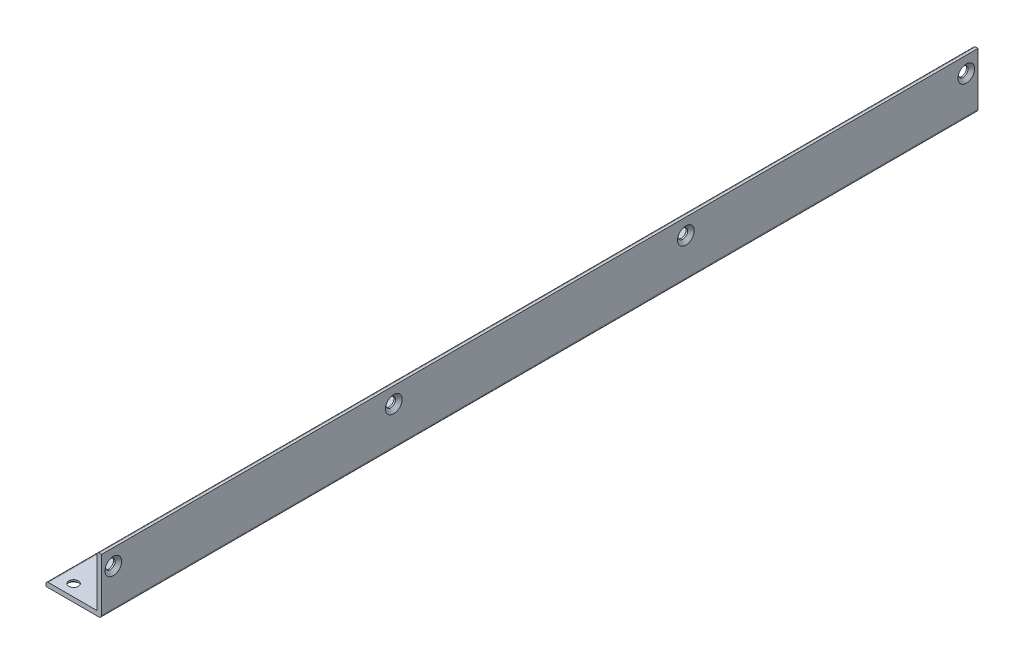
ISO-10303-21;
HEADER;
FILE_DESCRIPTION(('STEP AP214'),'2;1');
FILE_NAME('part.step','',(''),(''),'','','');
FILE_SCHEMA(('AUTOMOTIVE_DESIGN { 1 0 10303 214 1 1 1 1 }'));
ENDSEC;
DATA;
#1=APPLICATION_CONTEXT('core data for automotive mechanical design processes');
#2=APPLICATION_PROTOCOL_DEFINITION('international standard','automotive_design',2000,#1);
#3=PRODUCT_CONTEXT('',#1,'mechanical');
#4=PRODUCT('Part','Part','',(#3));
#5=PRODUCT_RELATED_PRODUCT_CATEGORY('part','',(#4));
#6=PRODUCT_DEFINITION_FORMATION('','',#4);
#7=PRODUCT_DEFINITION_CONTEXT('part definition',#1,'design');
#8=PRODUCT_DEFINITION('design','',#6,#7);
#9=PRODUCT_DEFINITION_SHAPE('','',#8);
#10=(LENGTH_UNIT() NAMED_UNIT(*) SI_UNIT(.MILLI.,.METRE.));
#11=(NAMED_UNIT(*) PLANE_ANGLE_UNIT() SI_UNIT($,.RADIAN.));
#12=(NAMED_UNIT(*) SI_UNIT($,.STERADIAN.) SOLID_ANGLE_UNIT());
#13=UNCERTAINTY_MEASURE_WITH_UNIT(LENGTH_MEASURE(1.E-05),#10,'distance_accuracy_value','');
#14=(GEOMETRIC_REPRESENTATION_CONTEXT(3) GLOBAL_UNCERTAINTY_ASSIGNED_CONTEXT((#13)) GLOBAL_UNIT_ASSIGNED_CONTEXT((#10,
#11,#12)) REPRESENTATION_CONTEXT('',''));
#15=CARTESIAN_POINT('',(0.,0.,0.));
#16=DIRECTION('',(0.,0.,1.));
#17=DIRECTION('',(1.,0.,0.));
#18=AXIS2_PLACEMENT_3D('',#15,#16,#17);
#19=CARTESIAN_POINT('',(8.73125,18.25625,-150.));
#20=DIRECTION('',(0.,0.,-1.));
#21=DIRECTION('',(-1.,0.,0.));
#22=AXIS2_PLACEMENT_3D('',#19,#20,#21);
#23=PLANE('',#22);
#24=DIRECTION('',(-1.,0.,0.));
#25=VECTOR('',#24,1.);
#26=CARTESIAN_POINT('',(7.14375000000001,1.5875,-150.));
#27=LINE('',#26,#25);
#28=CARTESIAN_POINT('',(7.93750000000001,1.5875,-150.));
#29=VERTEX_POINT('',#28);
#30=CARTESIAN_POINT('',(-8.73125,1.5875,-150.));
#31=VERTEX_POINT('',#30);
#32=EDGE_CURVE('E267',#29,#31,#27,.T.);
#33=ORIENTED_EDGE('',*,*,#32,.F.);
#34=DIRECTION('',(0.,-1.,0.));
#35=VECTOR('',#34,1.);
#36=CARTESIAN_POINT('',(7.9375,18.25625,-150.));
#37=LINE('',#36,#35);
#38=CARTESIAN_POINT('',(7.9375,18.25625,-150.));
#39=VERTEX_POINT('',#38);
#40=EDGE_CURVE('E146',#39,#29,#37,.T.);
#41=ORIENTED_EDGE('',*,*,#40,.F.);
#42=CARTESIAN_POINT('',(8.73125,18.25625,-150.));
#43=DIRECTION('',(0.,0.,1.));
#44=DIRECTION('',(-1.,0.,0.));
#45=AXIS2_PLACEMENT_3D('',#42,#43,#44);
#46=CIRCLE('',#45,0.793749999999999);
#47=CARTESIAN_POINT('',(8.73125,19.05,-150.));
#48=VERTEX_POINT('',#47);
#49=EDGE_CURVE('E264',#48,#39,#46,.T.);
#50=ORIENTED_EDGE('',*,*,#49,.F.);
#51=DIRECTION('',(-1.,0.,0.));
#52=VECTOR('',#51,1.);
#53=CARTESIAN_POINT('',(8.73125,19.05,-150.));
#54=LINE('',#53,#52);
#55=CARTESIAN_POINT('',(9.525,19.05,-150.));
#56=VERTEX_POINT('',#55);
#57=EDGE_CURVE('E262',#56,#48,#54,.T.);
#58=ORIENTED_EDGE('',*,*,#57,.F.);
#59=DIRECTION('',(0.,1.,0.));
#60=VECTOR('',#59,1.);
#61=CARTESIAN_POINT('',(9.525,0.,-150.));
#62=LINE('',#61,#60);
#63=CARTESIAN_POINT('',(9.525,1.,-150.));
#64=VERTEX_POINT('',#63);
#65=EDGE_CURVE('E260',#64,#56,#62,.T.);
#66=ORIENTED_EDGE('',*,*,#65,.F.);
#67=CARTESIAN_POINT('',(8.525,1.,-150.));
#68=DIRECTION('',(0.,0.,-1.));
#69=DIRECTION('',(-1.,0.,0.));
#70=AXIS2_PLACEMENT_3D('',#67,#68,#69);
#71=CIRCLE('',#70,1.);
#72=CARTESIAN_POINT('',(8.525,0.,-150.));
#73=VERTEX_POINT('',#72);
#74=EDGE_CURVE('E59',#64,#73,#71,.T.);
#75=ORIENTED_EDGE('',*,*,#74,.T.);
#76=DIRECTION('',(1.,0.,0.));
#77=VECTOR('',#76,1.);
#78=CARTESIAN_POINT('',(-9.525,0.,-150.));
#79=LINE('',#78,#77);
#80=CARTESIAN_POINT('',(-9.525,0.,-150.));
#81=VERTEX_POINT('',#80);
#82=EDGE_CURVE('E258',#81,#73,#79,.T.);
#83=ORIENTED_EDGE('',*,*,#82,.F.);
#84=DIRECTION('',(0.,-1.,0.));
#85=VECTOR('',#84,1.);
#86=CARTESIAN_POINT('',(-9.525,0.793749999999998,-150.));
#87=LINE('',#86,#85);
#88=CARTESIAN_POINT('',(-9.525,0.793749999999998,-150.));
#89=VERTEX_POINT('',#88);
#90=EDGE_CURVE('E255',#89,#81,#87,.T.);
#91=ORIENTED_EDGE('',*,*,#90,.F.);
#92=CARTESIAN_POINT('',(-8.73125,0.793749999999998,-150.));
#93=DIRECTION('',(0.,0.,1.));
#94=DIRECTION('',(-1.,0.,0.));
#95=AXIS2_PLACEMENT_3D('',#92,#93,#94);
#96=CIRCLE('',#95,0.793749999999998);
#97=EDGE_CURVE('E240',#31,#89,#96,.T.);
#98=ORIENTED_EDGE('',*,*,#97,.F.);
#99=EDGE_LOOP('',(#33,#41,#50,#58,#66,#75,#83,#91,#98));
#100=FACE_BOUND('',#99,.T.);
#101=ADVANCED_FACE('F35',(#100),#23,.T.);
#102=CARTESIAN_POINT('',(-9.525,0.793749999999998,150.));
#103=DIRECTION('',(1.,0.,0.));
#104=DIRECTION('',(0.,0.,-1.));
#105=AXIS2_PLACEMENT_3D('',#102,#103,#104);
#106=PLANE('',#105);
#107=ORIENTED_EDGE('',*,*,#90,.T.);
#108=DIRECTION('',(0.,0.,-1.));
#109=VECTOR('',#108,1.);
#110=CARTESIAN_POINT('',(-9.525,0.,150.));
#111=LINE('',#110,#109);
#112=CARTESIAN_POINT('',(-9.525,0.,150.));
#113=VERTEX_POINT('',#112);
#114=EDGE_CURVE('E286',#113,#81,#111,.T.);
#115=ORIENTED_EDGE('',*,*,#114,.F.);
#116=DIRECTION('',(0.,-1.,0.));
#117=VECTOR('',#116,1.);
#118=CARTESIAN_POINT('',(-9.525,0.793749999999998,150.));
#119=LINE('',#118,#117);
#120=CARTESIAN_POINT('',(-9.525,0.793749999999998,150.));
#121=VERTEX_POINT('',#120);
#122=EDGE_CURVE('E236',#121,#113,#119,.T.);
#123=ORIENTED_EDGE('',*,*,#122,.F.);
#124=DIRECTION('',(0.,0.,-1.));
#125=VECTOR('',#124,1.);
#126=CARTESIAN_POINT('',(-9.525,0.793749999999998,150.));
#127=LINE('',#126,#125);
#128=EDGE_CURVE('E254',#121,#89,#127,.T.);
#129=ORIENTED_EDGE('',*,*,#128,.T.);
#130=EDGE_LOOP('',(#107,#115,#123,#129));
#131=FACE_BOUND('',#130,.T.);
#132=ADVANCED_FACE('F326',(#131),#106,.F.);
#133=CARTESIAN_POINT('',(-9.525,0.,150.));
#134=DIRECTION('',(0.,1.,0.));
#135=DIRECTION('',(0.,0.,1.));
#136=AXIS2_PLACEMENT_3D('',#133,#134,#135);
#137=PLANE('',#136);
#138=CARTESIAN_POINT('',(-4.06249999999998,0.,50.));
#139=DIRECTION('',(0.,-1.,0.));
#140=DIRECTION('',(0.,0.,-1.));
#141=AXIS2_PLACEMENT_3D('',#138,#139,#140);
#142=CIRCLE('',#141,2.8575);
#143=CARTESIAN_POINT('',(-4.06249999999998,0.,47.1425));
#144=VERTEX_POINT('',#143);
#145=EDGE_CURVE('E163',#144,#144,#142,.T.);
#146=ORIENTED_EDGE('',*,*,#145,.F.);
#147=EDGE_LOOP('',(#146));
#148=FACE_BOUND('',#147,.T.);
#149=CARTESIAN_POINT('',(-4.06249999999998,0.,-50.));
#150=DIRECTION('',(0.,-1.,0.));
#151=DIRECTION('',(0.,0.,-1.));
#152=AXIS2_PLACEMENT_3D('',#149,#150,#151);
#153=CIRCLE('',#152,2.8575);
#154=CARTESIAN_POINT('',(-4.06249999999998,0.,-52.8575));
#155=VERTEX_POINT('',#154);
#156=EDGE_CURVE('E183',#155,#155,#153,.T.);
#157=ORIENTED_EDGE('',*,*,#156,.F.);
#158=EDGE_LOOP('',(#157));
#159=FACE_BOUND('',#158,.T.);
#160=CARTESIAN_POINT('',(3.49375000000001,0.,129.88));
#161=DIRECTION('',(0.,1.,0.));
#162=DIRECTION('',(0.,0.,1.));
#163=AXIS2_PLACEMENT_3D('',#160,#161,#162);
#164=CIRCLE('',#163,2.0574);
#165=CARTESIAN_POINT('',(3.49375000000001,0.,131.9374));
#166=VERTEX_POINT('',#165);
#167=EDGE_CURVE('E190',#166,#166,#164,.T.);
#168=ORIENTED_EDGE('',*,*,#167,.T.);
#169=EDGE_LOOP('',(#168));
#170=FACE_BOUND('',#169,.T.);
#171=CARTESIAN_POINT('',(-1.30624999999999,0.,129.88));
#172=DIRECTION('',(0.,1.,0.));
#173=DIRECTION('',(0.,0.,1.));
#174=AXIS2_PLACEMENT_3D('',#171,#172,#173);
#175=CIRCLE('',#174,2.0574);
#176=CARTESIAN_POINT('',(-1.30624999999999,0.,131.9374));
#177=VERTEX_POINT('',#176);
#178=EDGE_CURVE('E199',#177,#177,#175,.T.);
#179=ORIENTED_EDGE('',*,*,#178,.T.);
#180=EDGE_LOOP('',(#179));
#181=FACE_BOUND('',#180,.T.);
#182=CARTESIAN_POINT('',(-4.06250000000002,0.,146.));
#183=DIRECTION('',(0.,-1.,0.));
#184=DIRECTION('',(0.,0.,-1.));
#185=AXIS2_PLACEMENT_3D('',#182,#183,#184);
#186=CIRCLE('',#185,2.8575);
#187=CARTESIAN_POINT('',(-4.06250000000002,0.,143.1425));
#188=VERTEX_POINT('',#187);
#189=EDGE_CURVE('E222',#188,#188,#186,.T.);
#190=ORIENTED_EDGE('',*,*,#189,.F.);
#191=EDGE_LOOP('',(#190));
#192=FACE_BOUND('',#191,.T.);
#193=CARTESIAN_POINT('',(-4.06249999999998,0.,-146.));
#194=DIRECTION('',(0.,-1.,0.));
#195=DIRECTION('',(0.,0.,-1.));
#196=AXIS2_PLACEMENT_3D('',#193,#194,#195);
#197=CIRCLE('',#196,2.8575);
#198=CARTESIAN_POINT('',(-4.06249999999998,0.,-148.8575));
#199=VERTEX_POINT('',#198);
#200=EDGE_CURVE('E229',#199,#199,#197,.T.);
#201=ORIENTED_EDGE('',*,*,#200,.F.);
#202=EDGE_LOOP('',(#201));
#203=FACE_BOUND('',#202,.T.);
#204=ORIENTED_EDGE('',*,*,#82,.T.);
#205=DIRECTION('',(0.,0.,-1.));
#206=VECTOR('',#205,1.);
#207=CARTESIAN_POINT('',(8.525,0.,150.));
#208=LINE('',#207,#206);
#209=CARTESIAN_POINT('',(8.525,0.,150.));
#210=VERTEX_POINT('',#209);
#211=EDGE_CURVE('E44',#73,#210,#208,.F.);
#212=ORIENTED_EDGE('',*,*,#211,.T.);
#213=DIRECTION('',(1.,0.,0.));
#214=VECTOR('',#213,1.);
#215=CARTESIAN_POINT('',(-9.525,0.,150.));
#216=LINE('',#215,#214);
#217=EDGE_CURVE('E239',#113,#210,#216,.T.);
#218=ORIENTED_EDGE('',*,*,#217,.F.);
#219=ORIENTED_EDGE('',*,*,#114,.T.);
#220=EDGE_LOOP('',(#204,#212,#218,#219));
#221=FACE_BOUND('',#220,.T.);
#222=ADVANCED_FACE('F331',(#148,#159,#170,#181,#192,#203,#221),#137,.F.);
#223=CARTESIAN_POINT('',(9.525,0.,150.));
#224=DIRECTION('',(-1.,0.,0.));
#225=DIRECTION('',(0.,0.,1.));
#226=AXIS2_PLACEMENT_3D('',#223,#224,#225);
#227=PLANE('',#226);
#228=CARTESIAN_POINT('',(9.525,13.5875,50.));
#229=DIRECTION('',(1.,0.,0.));
#230=DIRECTION('',(0.,0.,-1.));
#231=AXIS2_PLACEMENT_3D('',#228,#229,#230);
#232=CIRCLE('',#231,2.8575);
#233=CARTESIAN_POINT('',(9.525,13.5875,47.1425));
#234=VERTEX_POINT('',#233);
#235=EDGE_CURVE('E169',#234,#234,#232,.T.);
#236=ORIENTED_EDGE('',*,*,#235,.F.);
#237=EDGE_LOOP('',(#236));
#238=FACE_BOUND('',#237,.T.);
#239=CARTESIAN_POINT('',(9.525,13.5875,-50.));
#240=DIRECTION('',(1.,0.,0.));
#241=DIRECTION('',(0.,0.,-1.));
#242=AXIS2_PLACEMENT_3D('',#239,#240,#241);
#243=CIRCLE('',#242,2.8575);
#244=CARTESIAN_POINT('',(9.525,13.5875,-52.8575));
#245=VERTEX_POINT('',#244);
#246=EDGE_CURVE('E176',#245,#245,#243,.T.);
#247=ORIENTED_EDGE('',*,*,#246,.F.);
#248=EDGE_LOOP('',(#247));
#249=FACE_BOUND('',#248,.T.);
#250=CARTESIAN_POINT('',(9.525,13.5875,146.));
#251=DIRECTION('',(1.,0.,0.));
#252=DIRECTION('',(0.,0.,-1.));
#253=AXIS2_PLACEMENT_3D('',#250,#251,#252);
#254=CIRCLE('',#253,2.8575);
#255=CARTESIAN_POINT('',(9.525,13.5875,143.1425));
#256=VERTEX_POINT('',#255);
#257=EDGE_CURVE('E208',#256,#256,#254,.T.);
#258=ORIENTED_EDGE('',*,*,#257,.F.);
#259=EDGE_LOOP('',(#258));
#260=FACE_BOUND('',#259,.T.);
#261=CARTESIAN_POINT('',(9.525,13.5875,-146.));
#262=DIRECTION('',(1.,0.,0.));
#263=DIRECTION('',(0.,0.,-1.));
#264=AXIS2_PLACEMENT_3D('',#261,#262,#263);
#265=CIRCLE('',#264,2.8575);
#266=CARTESIAN_POINT('',(9.525,13.5875,-148.8575));
#267=VERTEX_POINT('',#266);
#268=EDGE_CURVE('E215',#267,#267,#265,.T.);
#269=ORIENTED_EDGE('',*,*,#268,.F.);
#270=EDGE_LOOP('',(#269));
#271=FACE_BOUND('',#270,.T.);
#272=DIRECTION('',(0.,1.,0.));
#273=VECTOR('',#272,1.);
#274=CARTESIAN_POINT('',(9.525,0.,150.));
#275=LINE('',#274,#273);
#276=CARTESIAN_POINT('',(9.525,1.,150.));
#277=VERTEX_POINT('',#276);
#278=CARTESIAN_POINT('',(9.525,19.05,150.));
#279=VERTEX_POINT('',#278);
#280=EDGE_CURVE('E242',#277,#279,#275,.T.);
#281=ORIENTED_EDGE('',*,*,#280,.F.);
#282=DIRECTION('',(0.,0.,-1.));
#283=VECTOR('',#282,1.);
#284=CARTESIAN_POINT('',(9.525,1.,150.));
#285=LINE('',#284,#283);
#286=EDGE_CURVE('E289',#277,#64,#285,.T.);
#287=ORIENTED_EDGE('',*,*,#286,.T.);
#288=ORIENTED_EDGE('',*,*,#65,.T.);
#289=DIRECTION('',(0.,0.,-1.));
#290=VECTOR('',#289,1.);
#291=CARTESIAN_POINT('',(9.525,19.05,150.));
#292=LINE('',#291,#290);
#293=EDGE_CURVE('E283',#279,#56,#292,.T.);
#294=ORIENTED_EDGE('',*,*,#293,.F.);
#295=EDGE_LOOP('',(#281,#287,#288,#294));
#296=FACE_BOUND('',#295,.T.);
#297=ADVANCED_FACE('F356',(#238,#249,#260,#271,#296),#227,.F.);
#298=CARTESIAN_POINT('',(8.73125,19.05,150.));
#299=DIRECTION('',(0.,-1.,0.));
#300=DIRECTION('',(0.,0.,-1.));
#301=AXIS2_PLACEMENT_3D('',#298,#299,#300);
#302=PLANE('',#301);
#303=ORIENTED_EDGE('',*,*,#57,.T.);
#304=DIRECTION('',(0.,0.,-1.));
#305=VECTOR('',#304,1.);
#306=CARTESIAN_POINT('',(8.73125,19.05,150.));
#307=LINE('',#306,#305);
#308=CARTESIAN_POINT('',(8.73125,19.05,150.));
#309=VERTEX_POINT('',#308);
#310=EDGE_CURVE('E280',#309,#48,#307,.T.);
#311=ORIENTED_EDGE('',*,*,#310,.F.);
#312=DIRECTION('',(-1.,0.,0.));
#313=VECTOR('',#312,1.);
#314=CARTESIAN_POINT('',(8.73125,19.05,150.));
#315=LINE('',#314,#313);
#316=EDGE_CURVE('E244',#279,#309,#315,.T.);
#317=ORIENTED_EDGE('',*,*,#316,.F.);
#318=ORIENTED_EDGE('',*,*,#293,.T.);
#319=EDGE_LOOP('',(#303,#311,#317,#318));
#320=FACE_BOUND('',#319,.T.);
#321=ADVANCED_FACE('F352',(#320),#302,.F.);
#322=CARTESIAN_POINT('',(8.73125,18.25625,150.));
#323=DIRECTION('',(0.,0.,-1.));
#324=DIRECTION('',(-1.,0.,0.));
#325=AXIS2_PLACEMENT_3D('',#322,#323,#324);
#326=CYLINDRICAL_SURFACE('',#325,0.793749999999999);
#327=ORIENTED_EDGE('',*,*,#49,.T.);
#328=DIRECTION('',(0.,0.,-1.));
#329=VECTOR('',#328,1.);
#330=CARTESIAN_POINT('',(7.9375,18.25625,150.));
#331=LINE('',#330,#329);
#332=CARTESIAN_POINT('',(7.9375,18.25625,150.));
#333=VERTEX_POINT('',#332);
#334=EDGE_CURVE('E278',#333,#39,#331,.T.);
#335=ORIENTED_EDGE('',*,*,#334,.F.);
#336=CARTESIAN_POINT('',(8.73125,18.25625,150.));
#337=DIRECTION('',(0.,0.,1.));
#338=DIRECTION('',(-1.,0.,0.));
#339=AXIS2_PLACEMENT_3D('',#336,#337,#338);
#340=CIRCLE('',#339,0.793749999999999);
#341=EDGE_CURVE('E246',#309,#333,#340,.T.);
#342=ORIENTED_EDGE('',*,*,#341,.F.);
#343=ORIENTED_EDGE('',*,*,#310,.T.);
#344=EDGE_LOOP('',(#327,#335,#342,#343));
#345=FACE_BOUND('',#344,.T.);
#346=ADVANCED_FACE('F349',(#345),#326,.T.);
#347=CARTESIAN_POINT('',(7.9375,18.25625,150.));
#348=DIRECTION('',(1.,0.,0.));
#349=DIRECTION('',(0.,1.,0.));
#350=AXIS2_PLACEMENT_3D('',#347,#348,#349);
#351=PLANE('',#350);
#352=ORIENTED_EDGE('',*,*,#40,.T.);
#353=DIRECTION('',(0.,0.,-1.));
#354=VECTOR('',#353,1.);
#355=CARTESIAN_POINT('',(7.93750000000001,1.5875,-125.));
#356=LINE('',#355,#354);
#357=CARTESIAN_POINT('',(7.93750000000001,1.5875,-125.));
#358=VERTEX_POINT('',#357);
#359=EDGE_CURVE('E128',#358,#29,#356,.T.);
#360=ORIENTED_EDGE('',*,*,#359,.F.);
#361=DIRECTION('',(0.,1.,0.));
#362=VECTOR('',#361,1.);
#363=CARTESIAN_POINT('',(7.9375,6.5875,-125.));
#364=LINE('',#363,#362);
#365=CARTESIAN_POINT('',(7.93750000000001,2.38125,-125.));
#366=VERTEX_POINT('',#365);
#367=EDGE_CURVE('E135',#358,#366,#364,.T.);
#368=ORIENTED_EDGE('',*,*,#367,.T.);
#369=DIRECTION('',(0.,0.,-1.));
#370=VECTOR('',#369,1.);
#371=CARTESIAN_POINT('',(7.93750000000001,2.38125,150.));
#372=LINE('',#371,#370);
#373=CARTESIAN_POINT('',(7.93750000000001,2.38125,125.));
#374=VERTEX_POINT('',#373);
#375=EDGE_CURVE('E276',#374,#366,#372,.T.);
#376=ORIENTED_EDGE('',*,*,#375,.F.);
#377=DIRECTION('',(0.,1.,0.));
#378=VECTOR('',#377,1.);
#379=CARTESIAN_POINT('',(7.9375,6.5875,125.));
#380=LINE('',#379,#378);
#381=CARTESIAN_POINT('',(7.93750000000001,1.5875,125.));
#382=VERTEX_POINT('',#381);
#383=EDGE_CURVE('E155',#382,#374,#380,.T.);
#384=ORIENTED_EDGE('',*,*,#383,.F.);
#385=DIRECTION('',(0.,0.,1.));
#386=VECTOR('',#385,1.);
#387=CARTESIAN_POINT('',(7.93750000000001,1.5875,125.));
#388=LINE('',#387,#386);
#389=CARTESIAN_POINT('',(7.93750000000001,1.5875,150.));
#390=VERTEX_POINT('',#389);
#391=EDGE_CURVE('E157',#382,#390,#388,.T.);
#392=ORIENTED_EDGE('',*,*,#391,.T.);
#393=DIRECTION('',(0.,-1.,0.));
#394=VECTOR('',#393,1.);
#395=CARTESIAN_POINT('',(7.9375,18.25625,150.));
#396=LINE('',#395,#394);
#397=EDGE_CURVE('E248',#333,#390,#396,.T.);
#398=ORIENTED_EDGE('',*,*,#397,.F.);
#399=ORIENTED_EDGE('',*,*,#334,.T.);
#400=EDGE_LOOP('',(#352,#360,#368,#376,#384,#392,#398,#399));
#401=FACE_BOUND('',#400,.T.);
#402=CARTESIAN_POINT('',(7.93750000000001,13.5875,-146.));
#403=DIRECTION('',(1.,0.,0.));
#404=DIRECTION('',(0.,1.,0.));
#405=AXIS2_PLACEMENT_3D('',#402,#403,#404);
#406=CIRCLE('',#405,1.63195);
#407=CARTESIAN_POINT('',(7.93750000000001,15.21945,-146.));
#408=VERTEX_POINT('',#407);
#409=EDGE_CURVE('E221',#408,#408,#406,.T.);
#410=ORIENTED_EDGE('',*,*,#409,.T.);
#411=EDGE_LOOP('',(#410));
#412=FACE_BOUND('',#411,.T.);
#413=CARTESIAN_POINT('',(7.93750000000001,13.5875,146.));
#414=DIRECTION('',(1.,0.,0.));
#415=DIRECTION('',(0.,1.,0.));
#416=AXIS2_PLACEMENT_3D('',#413,#414,#415);
#417=CIRCLE('',#416,1.63195);
#418=CARTESIAN_POINT('',(7.93750000000001,15.21945,146.));
#419=VERTEX_POINT('',#418);
#420=EDGE_CURVE('E214',#419,#419,#417,.T.);
#421=ORIENTED_EDGE('',*,*,#420,.T.);
#422=EDGE_LOOP('',(#421));
#423=FACE_BOUND('',#422,.T.);
#424=CARTESIAN_POINT('',(7.93750000000001,13.5875,-50.));
#425=DIRECTION('',(1.,0.,0.));
#426=DIRECTION('',(0.,1.,0.));
#427=AXIS2_PLACEMENT_3D('',#424,#425,#426);
#428=CIRCLE('',#427,1.63194999999999);
#429=CARTESIAN_POINT('',(7.93750000000001,15.21945,-50.));
#430=VERTEX_POINT('',#429);
#431=EDGE_CURVE('E182',#430,#430,#428,.T.);
#432=ORIENTED_EDGE('',*,*,#431,.T.);
#433=EDGE_LOOP('',(#432));
#434=FACE_BOUND('',#433,.T.);
#435=CARTESIAN_POINT('',(7.93750000000001,13.5875,50.));
#436=DIRECTION('',(1.,0.,0.));
#437=DIRECTION('',(0.,1.,0.));
#438=AXIS2_PLACEMENT_3D('',#435,#436,#437);
#439=CIRCLE('',#438,1.63194999999999);
#440=CARTESIAN_POINT('',(7.93750000000001,15.21945,50.));
#441=VERTEX_POINT('',#440);
#442=EDGE_CURVE('E175',#441,#441,#439,.T.);
#443=ORIENTED_EDGE('',*,*,#442,.T.);
#444=EDGE_LOOP('',(#443));
#445=FACE_BOUND('',#444,.T.);
#446=ADVANCED_FACE('F140',(#401,#412,#423,#434,#445),#351,.F.);
#447=CARTESIAN_POINT('',(7.14375000000001,2.38125,150.));
#448=DIRECTION('',(0.,0.,-1.));
#449=DIRECTION('',(-1.,0.,0.));
#450=AXIS2_PLACEMENT_3D('',#447,#448,#449);
#451=CYLINDRICAL_SURFACE('',#450,0.793749999999999);
#452=ORIENTED_EDGE('',*,*,#375,.T.);
#453=CARTESIAN_POINT('',(7.14375000000001,2.38125,-125.));
#454=DIRECTION('',(0.,0.,1.));
#455=DIRECTION('',(1.,0.,0.));
#456=AXIS2_PLACEMENT_3D('',#453,#454,#455);
#457=CIRCLE('',#456,0.793749999999999);
#458=CARTESIAN_POINT('',(7.14375000000001,1.5875,-125.));
#459=VERTEX_POINT('',#458);
#460=EDGE_CURVE('E147',#366,#459,#457,.F.);
#461=ORIENTED_EDGE('',*,*,#460,.T.);
#462=DIRECTION('',(0.,0.,-1.));
#463=VECTOR('',#462,1.);
#464=CARTESIAN_POINT('',(7.14375000000001,1.5875,150.));
#465=LINE('',#464,#463);
#466=CARTESIAN_POINT('',(7.14375000000001,1.5875,125.));
#467=VERTEX_POINT('',#466);
#468=EDGE_CURVE('E131',#467,#459,#465,.T.);
#469=ORIENTED_EDGE('',*,*,#468,.F.);
#470=CARTESIAN_POINT('',(7.14375000000001,2.38125,125.));
#471=DIRECTION('',(0.,0.,-1.));
#472=DIRECTION('',(-1.,0.,0.));
#473=AXIS2_PLACEMENT_3D('',#470,#471,#472);
#474=CIRCLE('',#473,0.793749999999999);
#475=EDGE_CURVE('E160',#467,#374,#474,.F.);
#476=ORIENTED_EDGE('',*,*,#475,.T.);
#477=EDGE_LOOP('',(#452,#461,#469,#476));
#478=FACE_BOUND('',#477,.T.);
#479=ADVANCED_FACE('F343',(#478),#451,.F.);
#480=CARTESIAN_POINT('',(7.14375000000001,1.5875,150.));
#481=DIRECTION('',(0.,-1.,0.));
#482=DIRECTION('',(1.,0.,0.));
#483=AXIS2_PLACEMENT_3D('',#480,#481,#482);
#484=PLANE('',#483);
#485=ORIENTED_EDGE('',*,*,#32,.T.);
#486=DIRECTION('',(0.,0.,-1.));
#487=VECTOR('',#486,1.);
#488=CARTESIAN_POINT('',(-8.73125,1.5875,150.));
#489=LINE('',#488,#487);
#490=CARTESIAN_POINT('',(-8.73125,1.5875,150.));
#491=VERTEX_POINT('',#490);
#492=EDGE_CURVE('E272',#491,#31,#489,.T.);
#493=ORIENTED_EDGE('',*,*,#492,.F.);
#494=DIRECTION('',(-1.,0.,0.));
#495=VECTOR('',#494,1.);
#496=CARTESIAN_POINT('',(7.14375000000001,1.5875,150.));
#497=LINE('',#496,#495);
#498=EDGE_CURVE('E250',#390,#491,#497,.T.);
#499=ORIENTED_EDGE('',*,*,#498,.F.);
#500=ORIENTED_EDGE('',*,*,#391,.F.);
#501=DIRECTION('',(1.,0.,0.));
#502=VECTOR('',#501,1.);
#503=CARTESIAN_POINT('',(2.9375,1.5875,125.));
#504=LINE('',#503,#502);
#505=EDGE_CURVE('E153',#467,#382,#504,.T.);
#506=ORIENTED_EDGE('',*,*,#505,.F.);
#507=ORIENTED_EDGE('',*,*,#468,.T.);
#508=DIRECTION('',(1.,0.,0.));
#509=VECTOR('',#508,1.);
#510=CARTESIAN_POINT('',(2.9375,1.5875,-125.));
#511=LINE('',#510,#509);
#512=EDGE_CURVE('E124',#459,#358,#511,.T.);
#513=ORIENTED_EDGE('',*,*,#512,.T.);
#514=ORIENTED_EDGE('',*,*,#359,.T.);
#515=EDGE_LOOP('',(#485,#493,#499,#500,#506,#507,#513,#514));
#516=FACE_BOUND('',#515,.T.);
#517=CARTESIAN_POINT('',(-4.06249999999998,1.5875,-146.));
#518=DIRECTION('',(0.,-1.,0.));
#519=DIRECTION('',(1.,0.,0.));
#520=AXIS2_PLACEMENT_3D('',#517,#518,#519);
#521=CIRCLE('',#520,1.63195);
#522=CARTESIAN_POINT('',(-2.43054999999999,1.5875,-146.));
#523=VERTEX_POINT('',#522);
#524=EDGE_CURVE('E235',#523,#523,#521,.T.);
#525=ORIENTED_EDGE('',*,*,#524,.T.);
#526=EDGE_LOOP('',(#525));
#527=FACE_BOUND('',#526,.T.);
#528=CARTESIAN_POINT('',(-4.06250000000002,1.5875,146.));
#529=DIRECTION('',(0.,-1.,0.));
#530=DIRECTION('',(1.,0.,0.));
#531=AXIS2_PLACEMENT_3D('',#528,#529,#530);
#532=CIRCLE('',#531,1.63195);
#533=CARTESIAN_POINT('',(-2.43055000000002,1.5875,146.));
#534=VERTEX_POINT('',#533);
#535=EDGE_CURVE('E228',#534,#534,#532,.T.);
#536=ORIENTED_EDGE('',*,*,#535,.T.);
#537=EDGE_LOOP('',(#536));
#538=FACE_BOUND('',#537,.T.);
#539=CARTESIAN_POINT('',(-1.30624999999999,1.5875,129.88));
#540=DIRECTION('',(0.,1.,0.));
#541=DIRECTION('',(0.,0.,1.));
#542=AXIS2_PLACEMENT_3D('',#539,#540,#541);
#543=CIRCLE('',#542,1.21919999999999);
#544=CARTESIAN_POINT('',(-1.30624999999999,1.5875,131.0992));
#545=VERTEX_POINT('',#544);
#546=EDGE_CURVE('E202',#545,#545,#543,.T.);
#547=ORIENTED_EDGE('',*,*,#546,.F.);
#548=EDGE_LOOP('',(#547));
#549=FACE_BOUND('',#548,.T.);
#550=CARTESIAN_POINT('',(-4.06249999999998,1.5875,-50.));
#551=DIRECTION('',(0.,-1.,0.));
#552=DIRECTION('',(1.,0.,0.));
#553=AXIS2_PLACEMENT_3D('',#550,#551,#552);
#554=CIRCLE('',#553,1.63194999999999);
#555=CARTESIAN_POINT('',(-2.43054999999999,1.5875,-50.));
#556=VERTEX_POINT('',#555);
#557=EDGE_CURVE('E189',#556,#556,#554,.T.);
#558=ORIENTED_EDGE('',*,*,#557,.T.);
#559=EDGE_LOOP('',(#558));
#560=FACE_BOUND('',#559,.T.);
#561=CARTESIAN_POINT('',(-4.06249999999998,1.5875,50.));
#562=DIRECTION('',(0.,-1.,0.));
#563=DIRECTION('',(1.,0.,0.));
#564=AXIS2_PLACEMENT_3D('',#561,#562,#563);
#565=CIRCLE('',#564,1.63194999999999);
#566=CARTESIAN_POINT('',(-2.43055,1.5875,50.));
#567=VERTEX_POINT('',#566);
#568=EDGE_CURVE('E39',#567,#567,#565,.T.);
#569=ORIENTED_EDGE('',*,*,#568,.T.);
#570=EDGE_LOOP('',(#569));
#571=FACE_BOUND('',#570,.T.);
#572=CARTESIAN_POINT('',(3.49375000000001,1.5875,129.88));
#573=DIRECTION('',(0.,1.,0.));
#574=DIRECTION('',(0.,0.,1.));
#575=AXIS2_PLACEMENT_3D('',#572,#573,#574);
#576=CIRCLE('',#575,1.21919999999999);
#577=CARTESIAN_POINT('',(3.49375000000001,1.5875,131.0992));
#578=VERTEX_POINT('',#577);
#579=EDGE_CURVE('E193',#578,#578,#576,.T.);
#580=ORIENTED_EDGE('',*,*,#579,.F.);
#581=EDGE_LOOP('',(#580));
#582=FACE_BOUND('',#581,.T.);
#583=ADVANCED_FACE('F126',(#516,#527,#538,#549,#560,#571,#582),#484,.F.);
#584=CARTESIAN_POINT('',(-8.73125,0.793749999999998,150.));
#585=DIRECTION('',(0.,0.,-1.));
#586=DIRECTION('',(-1.,0.,0.));
#587=AXIS2_PLACEMENT_3D('',#584,#585,#586);
#588=CYLINDRICAL_SURFACE('',#587,0.793749999999998);
#589=ORIENTED_EDGE('',*,*,#97,.T.);
#590=ORIENTED_EDGE('',*,*,#128,.F.);
#591=CARTESIAN_POINT('',(-8.73125,0.793749999999998,150.));
#592=DIRECTION('',(0.,0.,1.));
#593=DIRECTION('',(-1.,0.,0.));
#594=AXIS2_PLACEMENT_3D('',#591,#592,#593);
#595=CIRCLE('',#594,0.793749999999998);
#596=EDGE_CURVE('E252',#491,#121,#595,.T.);
#597=ORIENTED_EDGE('',*,*,#596,.F.);
#598=ORIENTED_EDGE('',*,*,#492,.T.);
#599=EDGE_LOOP('',(#589,#590,#597,#598));
#600=FACE_BOUND('',#599,.T.);
#601=ADVANCED_FACE('F337',(#600),#588,.T.);
#602=CARTESIAN_POINT('',(8.73125,18.25625,150.));
#603=DIRECTION('',(0.,0.,-1.));
#604=DIRECTION('',(-1.,0.,0.));
#605=AXIS2_PLACEMENT_3D('',#602,#603,#604);
#606=PLANE('',#605);
#607=ORIENTED_EDGE('',*,*,#397,.T.);
#608=ORIENTED_EDGE('',*,*,#498,.T.);
#609=ORIENTED_EDGE('',*,*,#596,.T.);
#610=ORIENTED_EDGE('',*,*,#122,.T.);
#611=ORIENTED_EDGE('',*,*,#217,.T.);
#612=CARTESIAN_POINT('',(8.525,1.,150.));
#613=DIRECTION('',(0.,0.,-1.));
#614=DIRECTION('',(-1.,0.,0.));
#615=AXIS2_PLACEMENT_3D('',#612,#613,#614);
#616=CIRCLE('',#615,1.);
#617=EDGE_CURVE('E11',#210,#277,#616,.F.);
#618=ORIENTED_EDGE('',*,*,#617,.T.);
#619=ORIENTED_EDGE('',*,*,#280,.T.);
#620=ORIENTED_EDGE('',*,*,#316,.T.);
#621=ORIENTED_EDGE('',*,*,#341,.T.);
#622=EDGE_LOOP('',(#607,#608,#609,#610,#611,#618,#619,#620,#621));
#623=FACE_BOUND('',#622,.T.);
#624=ADVANCED_FACE('F335',(#623),#606,.F.);
#625=CARTESIAN_POINT('',(-4.06249999999998,0.,-146.));
#626=DIRECTION('',(0.,-1.,0.));
#627=DIRECTION('',(0.,0.,-1.));
#628=AXIS2_PLACEMENT_3D('',#625,#626,#627);
#629=CYLINDRICAL_SURFACE('',#628,1.63195);
#630=CARTESIAN_POINT('',(-4.06249999999998,1.02835855298932,-146.));
#631=DIRECTION('',(0.,-1.,0.));
#632=DIRECTION('',(0.,0.,-1.));
#633=AXIS2_PLACEMENT_3D('',#630,#631,#632);
#634=CIRCLE('',#633,1.63195);
#635=CARTESIAN_POINT('',(-4.06249999999998,1.02835855298932,-147.63195));
#636=VERTEX_POINT('',#635);
#637=EDGE_CURVE('E232',#636,#636,#634,.T.);
#638=ORIENTED_EDGE('',*,*,#637,.T.);
#639=EDGE_LOOP('',(#638));
#640=FACE_BOUND('',#639,.T.);
#641=ORIENTED_EDGE('',*,*,#524,.F.);
#642=EDGE_LOOP('',(#641));
#643=FACE_BOUND('',#642,.T.);
#644=ADVANCED_FACE('F477',(#640,#643),#629,.F.);
#645=CARTESIAN_POINT('',(-4.06249999999998,0.,-146.));
#646=DIRECTION('',(0.,-1.,0.));
#647=DIRECTION('',(0.,0.,-1.));
#648=AXIS2_PLACEMENT_3D('',#645,#646,#647);
#649=CONICAL_SURFACE('',#648,2.8575,0.872664625997165);
#650=ORIENTED_EDGE('',*,*,#637,.F.);
#651=EDGE_LOOP('',(#650));
#652=FACE_BOUND('',#651,.T.);
#653=ORIENTED_EDGE('',*,*,#200,.T.);
#654=EDGE_LOOP('',(#653));
#655=FACE_BOUND('',#654,.T.);
#656=ADVANCED_FACE('F474',(#652,#655),#649,.F.);
#657=CARTESIAN_POINT('',(-4.06250000000002,0.,146.));
#658=DIRECTION('',(0.,-1.,0.));
#659=DIRECTION('',(0.,0.,-1.));
#660=AXIS2_PLACEMENT_3D('',#657,#658,#659);
#661=CYLINDRICAL_SURFACE('',#660,1.63195);
#662=CARTESIAN_POINT('',(-4.06250000000002,1.02835855298932,146.));
#663=DIRECTION('',(0.,-1.,0.));
#664=DIRECTION('',(0.,0.,-1.));
#665=AXIS2_PLACEMENT_3D('',#662,#663,#664);
#666=CIRCLE('',#665,1.63195);
#667=CARTESIAN_POINT('',(-4.06250000000002,1.02835855298932,144.36805));
#668=VERTEX_POINT('',#667);
#669=EDGE_CURVE('E225',#668,#668,#666,.T.);
#670=ORIENTED_EDGE('',*,*,#669,.T.);
#671=EDGE_LOOP('',(#670));
#672=FACE_BOUND('',#671,.T.);
#673=ORIENTED_EDGE('',*,*,#535,.F.);
#674=EDGE_LOOP('',(#673));
#675=FACE_BOUND('',#674,.T.);
#676=ADVANCED_FACE('F470',(#672,#675),#661,.F.);
#677=CARTESIAN_POINT('',(-4.06250000000002,0.,146.));
#678=DIRECTION('',(0.,-1.,0.));
#679=DIRECTION('',(0.,0.,-1.));
#680=AXIS2_PLACEMENT_3D('',#677,#678,#679);
#681=CONICAL_SURFACE('',#680,2.8575,0.872664625997165);
#682=ORIENTED_EDGE('',*,*,#669,.F.);
#683=EDGE_LOOP('',(#682));
#684=FACE_BOUND('',#683,.T.);
#685=ORIENTED_EDGE('',*,*,#189,.T.);
#686=EDGE_LOOP('',(#685));
#687=FACE_BOUND('',#686,.T.);
#688=ADVANCED_FACE('F466',(#684,#687),#681,.F.);
#689=CARTESIAN_POINT('',(9.525,13.5875,-146.));
#690=DIRECTION('',(1.,0.,0.));
#691=DIRECTION('',(0.,0.,-1.));
#692=AXIS2_PLACEMENT_3D('',#689,#690,#691);
#693=CYLINDRICAL_SURFACE('',#692,1.63195);
#694=CARTESIAN_POINT('',(8.49664144701068,13.5875,-146.));
#695=DIRECTION('',(1.,0.,0.));
#696=DIRECTION('',(0.,0.,-1.));
#697=AXIS2_PLACEMENT_3D('',#694,#695,#696);
#698=CIRCLE('',#697,1.63195);
#699=CARTESIAN_POINT('',(8.49664144701068,13.5875,-147.63195));
#700=VERTEX_POINT('',#699);
#701=EDGE_CURVE('E218',#700,#700,#698,.T.);
#702=ORIENTED_EDGE('',*,*,#701,.T.);
#703=EDGE_LOOP('',(#702));
#704=FACE_BOUND('',#703,.T.);
#705=ORIENTED_EDGE('',*,*,#409,.F.);
#706=EDGE_LOOP('',(#705));
#707=FACE_BOUND('',#706,.T.);
#708=ADVANCED_FACE('F462',(#704,#707),#693,.F.);
#709=CARTESIAN_POINT('',(9.525,13.5875,-146.));
#710=DIRECTION('',(1.,0.,0.));
#711=DIRECTION('',(0.,0.,-1.));
#712=AXIS2_PLACEMENT_3D('',#709,#710,#711);
#713=CONICAL_SURFACE('',#712,2.8575,0.872664625997165);
#714=ORIENTED_EDGE('',*,*,#701,.F.);
#715=EDGE_LOOP('',(#714));
#716=FACE_BOUND('',#715,.T.);
#717=ORIENTED_EDGE('',*,*,#268,.T.);
#718=EDGE_LOOP('',(#717));
#719=FACE_BOUND('',#718,.T.);
#720=ADVANCED_FACE('F458',(#716,#719),#713,.F.);
#721=CARTESIAN_POINT('',(9.525,13.5875,146.));
#722=DIRECTION('',(1.,0.,0.));
#723=DIRECTION('',(0.,0.,-1.));
#724=AXIS2_PLACEMENT_3D('',#721,#722,#723);
#725=CYLINDRICAL_SURFACE('',#724,1.63195);
#726=CARTESIAN_POINT('',(8.49664144701068,13.5875,146.));
#727=DIRECTION('',(1.,0.,0.));
#728=DIRECTION('',(0.,0.,-1.));
#729=AXIS2_PLACEMENT_3D('',#726,#727,#728);
#730=CIRCLE('',#729,1.63195);
#731=CARTESIAN_POINT('',(8.49664144701068,13.5875,144.36805));
#732=VERTEX_POINT('',#731);
#733=EDGE_CURVE('E211',#732,#732,#730,.T.);
#734=ORIENTED_EDGE('',*,*,#733,.T.);
#735=EDGE_LOOP('',(#734));
#736=FACE_BOUND('',#735,.T.);
#737=ORIENTED_EDGE('',*,*,#420,.F.);
#738=EDGE_LOOP('',(#737));
#739=FACE_BOUND('',#738,.T.);
#740=ADVANCED_FACE('F454',(#736,#739),#725,.F.);
#741=CARTESIAN_POINT('',(9.525,13.5875,146.));
#742=DIRECTION('',(1.,0.,0.));
#743=DIRECTION('',(0.,0.,-1.));
#744=AXIS2_PLACEMENT_3D('',#741,#742,#743);
#745=CONICAL_SURFACE('',#744,2.8575,0.872664625997165);
#746=ORIENTED_EDGE('',*,*,#733,.F.);
#747=EDGE_LOOP('',(#746));
#748=FACE_BOUND('',#747,.T.);
#749=ORIENTED_EDGE('',*,*,#257,.T.);
#750=EDGE_LOOP('',(#749));
#751=FACE_BOUND('',#750,.T.);
#752=ADVANCED_FACE('F451',(#748,#751),#745,.F.);
#753=CARTESIAN_POINT('',(8.525,1.,150.));
#754=DIRECTION('',(0.,0.,-1.));
#755=DIRECTION('',(-1.,0.,0.));
#756=AXIS2_PLACEMENT_3D('',#753,#754,#755);
#757=CYLINDRICAL_SURFACE('',#756,1.);
#758=ORIENTED_EDGE('',*,*,#617,.F.);
#759=ORIENTED_EDGE('',*,*,#211,.F.);
#760=ORIENTED_EDGE('',*,*,#74,.F.);
#761=ORIENTED_EDGE('',*,*,#286,.F.);
#762=EDGE_LOOP('',(#758,#759,#760,#761));
#763=FACE_BOUND('',#762,.T.);
#764=ADVANCED_FACE('F37',(#763),#757,.T.);
#765=CARTESIAN_POINT('',(-1.30624999999999,0.964238798932652,129.88));
#766=DIRECTION('',(0.,-1.,0.));
#767=DIRECTION('',(0.,0.,-1.));
#768=AXIS2_PLACEMENT_3D('',#765,#766,#767);
#769=CONICAL_SURFACE('',#768,1.2192,0.715584993317675);
#770=ORIENTED_EDGE('',*,*,#178,.F.);
#771=EDGE_LOOP('',(#770));
#772=FACE_BOUND('',#771,.T.);
#773=CARTESIAN_POINT('',(-1.30624999999999,0.964238798932652,129.88));
#774=DIRECTION('',(0.,1.,0.));
#775=DIRECTION('',(0.,0.,1.));
#776=AXIS2_PLACEMENT_3D('',#773,#774,#775);
#777=CIRCLE('',#776,1.2192);
#778=CARTESIAN_POINT('',(-1.30624999999999,0.964238798932652,131.0992));
#779=VERTEX_POINT('',#778);
#780=EDGE_CURVE('E205',#779,#779,#777,.T.);
#781=ORIENTED_EDGE('',*,*,#780,.T.);
#782=EDGE_LOOP('',(#781));
#783=FACE_BOUND('',#782,.T.);
#784=ADVANCED_FACE('F446',(#772,#783),#769,.F.);
#785=CARTESIAN_POINT('',(-1.30624999999999,1.5875,129.88));
#786=DIRECTION('',(0.,1.,0.));
#787=DIRECTION('',(0.,0.,1.));
#788=AXIS2_PLACEMENT_3D('',#785,#786,#787);
#789=CYLINDRICAL_SURFACE('',#788,1.21919999999999);
#790=ORIENTED_EDGE('',*,*,#780,.F.);
#791=EDGE_LOOP('',(#790));
#792=FACE_BOUND('',#791,.T.);
#793=ORIENTED_EDGE('',*,*,#546,.T.);
#794=EDGE_LOOP('',(#793));
#795=FACE_BOUND('',#794,.T.);
#796=ADVANCED_FACE('F438',(#792,#795),#789,.F.);
#797=CARTESIAN_POINT('',(3.49375000000001,0.964238798932652,129.88));
#798=DIRECTION('',(0.,-1.,0.));
#799=DIRECTION('',(0.,0.,-1.));
#800=AXIS2_PLACEMENT_3D('',#797,#798,#799);
#801=CONICAL_SURFACE('',#800,1.2192,0.715584993317675);
#802=ORIENTED_EDGE('',*,*,#167,.F.);
#803=EDGE_LOOP('',(#802));
#804=FACE_BOUND('',#803,.T.);
#805=CARTESIAN_POINT('',(3.49375000000001,0.964238798932652,129.88));
#806=DIRECTION('',(0.,1.,0.));
#807=DIRECTION('',(0.,0.,1.));
#808=AXIS2_PLACEMENT_3D('',#805,#806,#807);
#809=CIRCLE('',#808,1.2192);
#810=CARTESIAN_POINT('',(3.49375000000001,0.964238798932652,131.0992));
#811=VERTEX_POINT('',#810);
#812=EDGE_CURVE('E196',#811,#811,#809,.T.);
#813=ORIENTED_EDGE('',*,*,#812,.T.);
#814=EDGE_LOOP('',(#813));
#815=FACE_BOUND('',#814,.T.);
#816=ADVANCED_FACE('F428',(#804,#815),#801,.F.);
#817=CARTESIAN_POINT('',(3.49375000000001,1.5875,129.88));
#818=DIRECTION('',(0.,1.,0.));
#819=DIRECTION('',(0.,0.,1.));
#820=AXIS2_PLACEMENT_3D('',#817,#818,#819);
#821=CYLINDRICAL_SURFACE('',#820,1.21919999999999);
#822=ORIENTED_EDGE('',*,*,#812,.F.);
#823=EDGE_LOOP('',(#822));
#824=FACE_BOUND('',#823,.T.);
#825=ORIENTED_EDGE('',*,*,#579,.T.);
#826=EDGE_LOOP('',(#825));
#827=FACE_BOUND('',#826,.T.);
#828=ADVANCED_FACE('F425',(#824,#827),#821,.F.);
#829=CARTESIAN_POINT('',(-4.06249999999998,0.,-50.));
#830=DIRECTION('',(0.,-1.,0.));
#831=DIRECTION('',(0.,0.,-1.));
#832=AXIS2_PLACEMENT_3D('',#829,#830,#831);
#833=CYLINDRICAL_SURFACE('',#832,1.63194999999999);
#834=CARTESIAN_POINT('',(-4.06249999999998,1.02835855298932,-50.));
#835=DIRECTION('',(0.,-1.,0.));
#836=DIRECTION('',(0.,0.,-1.));
#837=AXIS2_PLACEMENT_3D('',#834,#835,#836);
#838=CIRCLE('',#837,1.63195);
#839=CARTESIAN_POINT('',(-4.06249999999998,1.02835855298932,-51.63195));
#840=VERTEX_POINT('',#839);
#841=EDGE_CURVE('E186',#840,#840,#838,.T.);
#842=ORIENTED_EDGE('',*,*,#841,.T.);
#843=EDGE_LOOP('',(#842));
#844=FACE_BOUND('',#843,.T.);
#845=ORIENTED_EDGE('',*,*,#557,.F.);
#846=EDGE_LOOP('',(#845));
#847=FACE_BOUND('',#846,.T.);
#848=ADVANCED_FACE('F427',(#844,#847),#833,.F.);
#849=CARTESIAN_POINT('',(-4.06249999999998,0.,-50.));
#850=DIRECTION('',(0.,-1.,0.));
#851=DIRECTION('',(0.,0.,-1.));
#852=AXIS2_PLACEMENT_3D('',#849,#850,#851);
#853=CONICAL_SURFACE('',#852,2.8575,0.872664625997164);
#854=ORIENTED_EDGE('',*,*,#841,.F.);
#855=EDGE_LOOP('',(#854));
#856=FACE_BOUND('',#855,.T.);
#857=ORIENTED_EDGE('',*,*,#156,.T.);
#858=EDGE_LOOP('',(#857));
#859=FACE_BOUND('',#858,.T.);
#860=ADVANCED_FACE('F435',(#856,#859),#853,.F.);
#861=CARTESIAN_POINT('',(9.525,13.5875,-50.));
#862=DIRECTION('',(1.,0.,0.));
#863=DIRECTION('',(0.,0.,-1.));
#864=AXIS2_PLACEMENT_3D('',#861,#862,#863);
#865=CYLINDRICAL_SURFACE('',#864,1.63194999999999);
#866=CARTESIAN_POINT('',(8.49664144701067,13.5875,-50.));
#867=DIRECTION('',(1.,0.,0.));
#868=DIRECTION('',(0.,0.,-1.));
#869=AXIS2_PLACEMENT_3D('',#866,#867,#868);
#870=CIRCLE('',#869,1.63194999999999);
#871=CARTESIAN_POINT('',(8.49664144701067,13.5875,-51.63195));
#872=VERTEX_POINT('',#871);
#873=EDGE_CURVE('E179',#872,#872,#870,.T.);
#874=ORIENTED_EDGE('',*,*,#873,.T.);
#875=EDGE_LOOP('',(#874));
#876=FACE_BOUND('',#875,.T.);
#877=ORIENTED_EDGE('',*,*,#431,.F.);
#878=EDGE_LOOP('',(#877));
#879=FACE_BOUND('',#878,.T.);
#880=ADVANCED_FACE('F322',(#876,#879),#865,.F.);
#881=CARTESIAN_POINT('',(9.525,13.5875,-50.));
#882=DIRECTION('',(1.,0.,0.));
#883=DIRECTION('',(0.,0.,-1.));
#884=AXIS2_PLACEMENT_3D('',#881,#882,#883);
#885=CONICAL_SURFACE('',#884,2.8575,0.872664625997162);
#886=ORIENTED_EDGE('',*,*,#873,.F.);
#887=EDGE_LOOP('',(#886));
#888=FACE_BOUND('',#887,.T.);
#889=ORIENTED_EDGE('',*,*,#246,.T.);
#890=EDGE_LOOP('',(#889));
#891=FACE_BOUND('',#890,.T.);
#892=ADVANCED_FACE('F312',(#888,#891),#885,.F.);
#893=CARTESIAN_POINT('',(9.525,13.5875,50.));
#894=DIRECTION('',(1.,0.,0.));
#895=DIRECTION('',(0.,0.,-1.));
#896=AXIS2_PLACEMENT_3D('',#893,#894,#895);
#897=CYLINDRICAL_SURFACE('',#896,1.63194999999999);
#898=CARTESIAN_POINT('',(8.49664144701067,13.5875,50.));
#899=DIRECTION('',(1.,0.,0.));
#900=DIRECTION('',(0.,0.,-1.));
#901=AXIS2_PLACEMENT_3D('',#898,#899,#900);
#902=CIRCLE('',#901,1.63194999999999);
#903=CARTESIAN_POINT('',(8.49664144701067,13.5875,48.36805));
#904=VERTEX_POINT('',#903);
#905=EDGE_CURVE('E172',#904,#904,#902,.T.);
#906=ORIENTED_EDGE('',*,*,#905,.T.);
#907=EDGE_LOOP('',(#906));
#908=FACE_BOUND('',#907,.T.);
#909=ORIENTED_EDGE('',*,*,#442,.F.);
#910=EDGE_LOOP('',(#909));
#911=FACE_BOUND('',#910,.T.);
#912=ADVANCED_FACE('F309',(#908,#911),#897,.F.);
#913=CARTESIAN_POINT('',(9.525,13.5875,50.));
#914=DIRECTION('',(1.,0.,0.));
#915=DIRECTION('',(0.,0.,-1.));
#916=AXIS2_PLACEMENT_3D('',#913,#914,#915);
#917=CONICAL_SURFACE('',#916,2.8575,0.872664625997162);
#918=ORIENTED_EDGE('',*,*,#905,.F.);
#919=EDGE_LOOP('',(#918));
#920=FACE_BOUND('',#919,.T.);
#921=ORIENTED_EDGE('',*,*,#235,.T.);
#922=EDGE_LOOP('',(#921));
#923=FACE_BOUND('',#922,.T.);
#924=ADVANCED_FACE('F311',(#920,#923),#917,.F.);
#925=CARTESIAN_POINT('',(-4.06249999999998,0.,50.));
#926=DIRECTION('',(0.,-1.,0.));
#927=DIRECTION('',(0.,0.,-1.));
#928=AXIS2_PLACEMENT_3D('',#925,#926,#927);
#929=CYLINDRICAL_SURFACE('',#928,1.63194999999999);
#930=CARTESIAN_POINT('',(-4.06249999999998,1.02835855298933,50.));
#931=DIRECTION('',(0.,-1.,0.));
#932=DIRECTION('',(0.,0.,-1.));
#933=AXIS2_PLACEMENT_3D('',#930,#931,#932);
#934=CIRCLE('',#933,1.63194999999999);
#935=CARTESIAN_POINT('',(-4.06249999999998,1.02835855298933,48.36805));
#936=VERTEX_POINT('',#935);
#937=EDGE_CURVE('E166',#936,#936,#934,.T.);
#938=ORIENTED_EDGE('',*,*,#937,.T.);
#939=EDGE_LOOP('',(#938));
#940=FACE_BOUND('',#939,.T.);
#941=ORIENTED_EDGE('',*,*,#568,.F.);
#942=EDGE_LOOP('',(#941));
#943=FACE_BOUND('',#942,.T.);
#944=ADVANCED_FACE('F319',(#940,#943),#929,.F.);
#945=CARTESIAN_POINT('',(-4.06249999999998,0.,50.));
#946=DIRECTION('',(0.,-1.,0.));
#947=DIRECTION('',(0.,0.,-1.));
#948=AXIS2_PLACEMENT_3D('',#945,#946,#947);
#949=CONICAL_SURFACE('',#948,2.8575,0.872664625997162);
#950=ORIENTED_EDGE('',*,*,#937,.F.);
#951=EDGE_LOOP('',(#950));
#952=FACE_BOUND('',#951,.T.);
#953=ORIENTED_EDGE('',*,*,#145,.T.);
#954=EDGE_LOOP('',(#953));
#955=FACE_BOUND('',#954,.T.);
#956=ADVANCED_FACE('F403',(#952,#955),#949,.F.);
#957=CARTESIAN_POINT('',(0.,0.,125.));
#958=DIRECTION('',(0.,0.,-1.));
#959=DIRECTION('',(-1.,0.,0.));
#960=AXIS2_PLACEMENT_3D('',#957,#958,#959);
#961=PLANE('',#960);
#962=ORIENTED_EDGE('',*,*,#505,.T.);
#963=ORIENTED_EDGE('',*,*,#383,.T.);
#964=ORIENTED_EDGE('',*,*,#475,.F.);
#965=EDGE_LOOP('',(#962,#963,#964));
#966=FACE_BOUND('',#965,.T.);
#967=ADVANCED_FACE('F401',(#966),#961,.F.);
#968=CARTESIAN_POINT('',(0.,0.,-125.));
#969=DIRECTION('',(0.,0.,1.));
#970=DIRECTION('',(-1.,0.,0.));
#971=AXIS2_PLACEMENT_3D('',#968,#969,#970);
#972=PLANE('',#971);
#973=ORIENTED_EDGE('',*,*,#367,.F.);
#974=ORIENTED_EDGE('',*,*,#512,.F.);
#975=ORIENTED_EDGE('',*,*,#460,.F.);
#976=EDGE_LOOP('',(#973,#974,#975));
#977=FACE_BOUND('',#976,.T.);
#978=ADVANCED_FACE('F149',(#977),#972,.F.);
#979=CLOSED_SHELL('',(#101,#132,#222,#297,#321,#346,#446,#479,#583,#601,#624,#644,#656,#676,
#688,#708,#720,#740,#752,#764,#784,#796,#816,#828,#848,#860,#880,#892,#912,#924,#944,#956,#967,#978));
#980=MANIFOLD_SOLID_BREP('B2',#979);
#981=ADVANCED_BREP_SHAPE_REPRESENTATION('',(#18,#980),#14);
#982=SHAPE_DEFINITION_REPRESENTATION(#9,#981);
ENDSEC;
END-ISO-10303-21;
